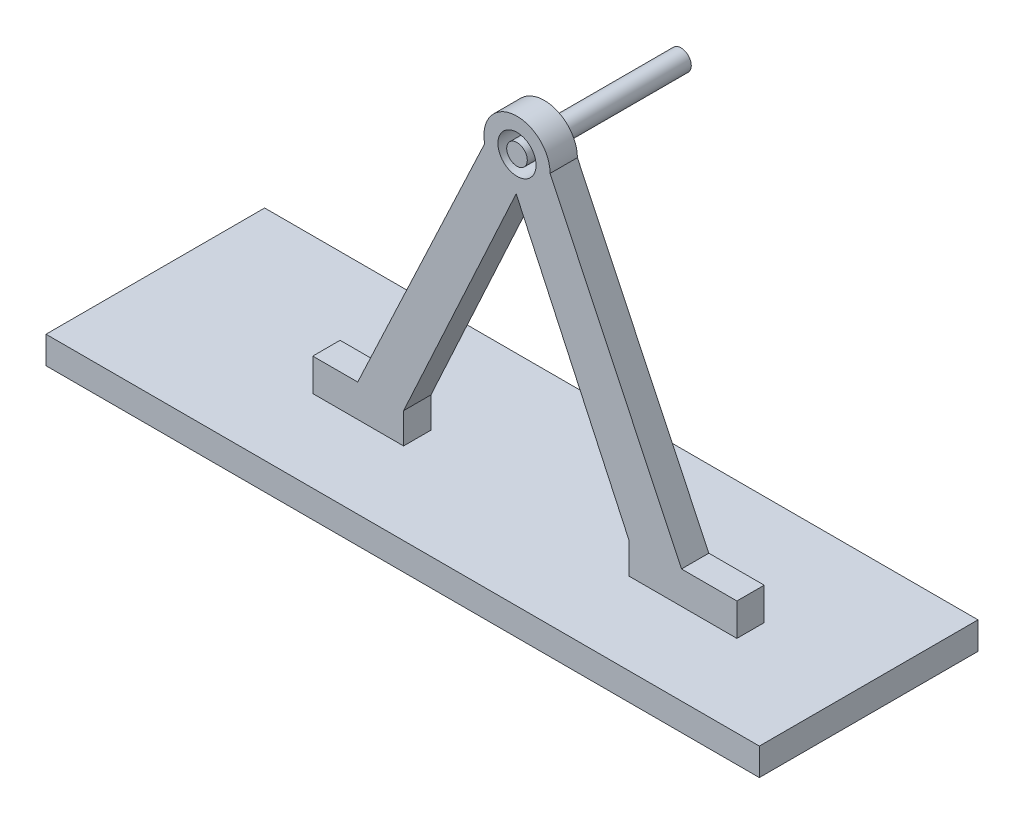
ISO-10303-21;
HEADER;
FILE_DESCRIPTION(('STEP AP214'),'2;1');
FILE_NAME('part.step','',(''),(''),'','','');
FILE_SCHEMA(('AUTOMOTIVE_DESIGN { 1 0 10303 214 1 1 1 1 }'));
ENDSEC;
DATA;
#1=APPLICATION_CONTEXT('core data for automotive mechanical design processes');
#2=APPLICATION_PROTOCOL_DEFINITION('international standard','automotive_design',2000,#1);
#3=PRODUCT_CONTEXT('',#1,'mechanical');
#4=PRODUCT('Part','Part','',(#3));
#5=PRODUCT_RELATED_PRODUCT_CATEGORY('part','',(#4));
#6=PRODUCT_DEFINITION_FORMATION('','',#4);
#7=PRODUCT_DEFINITION_CONTEXT('part definition',#1,'design');
#8=PRODUCT_DEFINITION('design','',#6,#7);
#9=PRODUCT_DEFINITION_SHAPE('','',#8);
#10=(LENGTH_UNIT() NAMED_UNIT(*) SI_UNIT(.MILLI.,.METRE.));
#11=(NAMED_UNIT(*) PLANE_ANGLE_UNIT() SI_UNIT($,.RADIAN.));
#12=(NAMED_UNIT(*) SI_UNIT($,.STERADIAN.) SOLID_ANGLE_UNIT());
#13=UNCERTAINTY_MEASURE_WITH_UNIT(LENGTH_MEASURE(1.E-05),#10,'distance_accuracy_value','');
#14=(GEOMETRIC_REPRESENTATION_CONTEXT(3) GLOBAL_UNCERTAINTY_ASSIGNED_CONTEXT((#13)) GLOBAL_UNIT_ASSIGNED_CONTEXT((#10,
#11,#12)) REPRESENTATION_CONTEXT('',''));
#15=CARTESIAN_POINT('',(0.,0.,0.));
#16=DIRECTION('',(0.,0.,1.));
#17=DIRECTION('',(1.,0.,0.));
#18=AXIS2_PLACEMENT_3D('',#15,#16,#17);
#19=CARTESIAN_POINT('',(72.3019356945702,62.562955716952,-45.72));
#20=DIRECTION('',(0.,0.,1.));
#21=DIRECTION('',(1.,0.,0.));
#22=AXIS2_PLACEMENT_3D('',#19,#20,#21);
#23=CYLINDRICAL_SURFACE('',#22,1.91572157546535);
#24=CARTESIAN_POINT('',(72.3019356945702,62.562955716952,-45.72));
#25=DIRECTION('',(0.,0.,1.));
#26=DIRECTION('',(1.,0.,0.));
#27=AXIS2_PLACEMENT_3D('',#24,#25,#26);
#28=CIRCLE('',#27,1.91572157546535);
#29=CARTESIAN_POINT('',(74.2176572700356,62.562955716952,-45.72));
#30=VERTEX_POINT('',#29);
#31=EDGE_CURVE('E11',#30,#30,#28,.T.);
#32=CARTESIAN_POINT('',(72.3019356945702,62.562955716952,-15.24));
#33=DIRECTION('',(0.,0.,1.));
#34=DIRECTION('',(1.,0.,0.));
#35=AXIS2_PLACEMENT_3D('',#32,#33,#34);
#36=CIRCLE('',#35,1.91572157546535);
#37=CARTESIAN_POINT('',(74.2176572700356,62.562955716952,-15.24));
#38=VERTEX_POINT('',#37);
#39=EDGE_CURVE('E50',#38,#38,#36,.T.);
#40=CARTESIAN_POINT('',(74.2176572700356,62.562955716952,-45.72));
#41=CARTESIAN_POINT('',(74.2176572700356,62.562955716952,-45.4025));
#42=CARTESIAN_POINT('',(74.2176572700356,62.562955716952,-45.085));
#43=CARTESIAN_POINT('',(74.2176572700356,62.562955716952,-44.45));
#44=CARTESIAN_POINT('',(74.2176572700356,62.562955716952,-44.1325));
#45=CARTESIAN_POINT('',(74.2176572700356,62.562955716952,-43.4975));
#46=CARTESIAN_POINT('',(74.2176572700356,62.562955716952,-43.18));
#47=CARTESIAN_POINT('',(74.2176572700356,62.562955716952,-42.545));
#48=CARTESIAN_POINT('',(74.2176572700356,62.562955716952,-42.2275));
#49=CARTESIAN_POINT('',(74.2176572700356,62.562955716952,-41.5925));
#50=CARTESIAN_POINT('',(74.2176572700356,62.562955716952,-41.275));
#51=CARTESIAN_POINT('',(74.2176572700356,62.562955716952,-40.64));
#52=CARTESIAN_POINT('',(74.2176572700356,62.562955716952,-40.3225));
#53=CARTESIAN_POINT('',(74.2176572700356,62.562955716952,-39.6875));
#54=CARTESIAN_POINT('',(74.2176572700356,62.562955716952,-39.37));
#55=CARTESIAN_POINT('',(74.2176572700356,62.562955716952,-38.735));
#56=CARTESIAN_POINT('',(74.2176572700356,62.562955716952,-38.4175));
#57=CARTESIAN_POINT('',(74.2176572700356,62.562955716952,-37.7825));
#58=CARTESIAN_POINT('',(74.2176572700356,62.562955716952,-37.465));
#59=CARTESIAN_POINT('',(74.2176572700356,62.562955716952,-36.83));
#60=CARTESIAN_POINT('',(74.2176572700356,62.562955716952,-36.5125));
#61=CARTESIAN_POINT('',(74.2176572700356,62.562955716952,-35.8775));
#62=CARTESIAN_POINT('',(74.2176572700356,62.562955716952,-35.56));
#63=CARTESIAN_POINT('',(74.2176572700356,62.562955716952,-34.925));
#64=CARTESIAN_POINT('',(74.2176572700356,62.562955716952,-34.6075));
#65=CARTESIAN_POINT('',(74.2176572700356,62.562955716952,-33.9725));
#66=CARTESIAN_POINT('',(74.2176572700356,62.562955716952,-33.655));
#67=CARTESIAN_POINT('',(74.2176572700356,62.562955716952,-33.02));
#68=CARTESIAN_POINT('',(74.2176572700356,62.562955716952,-32.7025));
#69=CARTESIAN_POINT('',(74.2176572700356,62.562955716952,-32.0675));
#70=CARTESIAN_POINT('',(74.2176572700356,62.562955716952,-31.75));
#71=CARTESIAN_POINT('',(74.2176572700356,62.562955716952,-31.115));
#72=CARTESIAN_POINT('',(74.2176572700356,62.562955716952,-30.7975));
#73=CARTESIAN_POINT('',(74.2176572700356,62.562955716952,-30.1625));
#74=CARTESIAN_POINT('',(74.2176572700356,62.562955716952,-29.845));
#75=CARTESIAN_POINT('',(74.2176572700356,62.562955716952,-29.21));
#76=CARTESIAN_POINT('',(74.2176572700356,62.562955716952,-28.8925));
#77=CARTESIAN_POINT('',(74.2176572700356,62.562955716952,-28.2575));
#78=CARTESIAN_POINT('',(74.2176572700356,62.562955716952,-27.94));
#79=CARTESIAN_POINT('',(74.2176572700356,62.562955716952,-27.305));
#80=CARTESIAN_POINT('',(74.2176572700356,62.562955716952,-26.9875));
#81=CARTESIAN_POINT('',(74.2176572700356,62.562955716952,-26.3525));
#82=CARTESIAN_POINT('',(74.2176572700356,62.562955716952,-26.035));
#83=CARTESIAN_POINT('',(74.2176572700356,62.562955716952,-25.4));
#84=CARTESIAN_POINT('',(74.2176572700356,62.562955716952,-25.0825));
#85=CARTESIAN_POINT('',(74.2176572700356,62.562955716952,-24.4475));
#86=CARTESIAN_POINT('',(74.2176572700356,62.562955716952,-24.13));
#87=CARTESIAN_POINT('',(74.2176572700356,62.562955716952,-23.495));
#88=CARTESIAN_POINT('',(74.2176572700356,62.562955716952,-23.1775));
#89=CARTESIAN_POINT('',(74.2176572700356,62.562955716952,-22.5425));
#90=CARTESIAN_POINT('',(74.2176572700356,62.562955716952,-22.225));
#91=CARTESIAN_POINT('',(74.2176572700356,62.562955716952,-21.59));
#92=CARTESIAN_POINT('',(74.2176572700356,62.562955716952,-21.2725));
#93=CARTESIAN_POINT('',(74.2176572700356,62.562955716952,-20.6375));
#94=CARTESIAN_POINT('',(74.2176572700356,62.562955716952,-20.32));
#95=CARTESIAN_POINT('',(74.2176572700356,62.562955716952,-19.685));
#96=CARTESIAN_POINT('',(74.2176572700356,62.562955716952,-19.3675));
#97=CARTESIAN_POINT('',(74.2176572700356,62.562955716952,-18.7325));
#98=CARTESIAN_POINT('',(74.2176572700356,62.562955716952,-18.415));
#99=CARTESIAN_POINT('',(74.2176572700356,62.562955716952,-17.78));
#100=CARTESIAN_POINT('',(74.2176572700356,62.562955716952,-17.4625));
#101=CARTESIAN_POINT('',(74.2176572700356,62.562955716952,-16.8275));
#102=CARTESIAN_POINT('',(74.2176572700356,62.562955716952,-16.51));
#103=CARTESIAN_POINT('',(74.2176572700356,62.562955716952,-15.875));
#104=CARTESIAN_POINT('',(74.2176572700356,62.562955716952,-15.5575));
#105=CARTESIAN_POINT('',(74.2176572700356,62.562955716952,-15.24));
#106=B_SPLINE_CURVE_WITH_KNOTS('',3,(#40,#41,#42,#43,#44,#45,#46,#47,#48,#49,#50,#51,#52,#53,
#54,#55,#56,#57,#58,#59,#60,#61,#62,#63,#64,#65,#66,#67,#68,#69,#70,#71,#72,#73,#74,#75,#76,#77,
#78,#79,#80,#81,#82,#83,#84,#85,#86,#87,#88,#89,#90,#91,#92,#93,#94,#95,#96,#97,#98,#99,#100,
#101,#102,#103,#104,#105),.UNSPECIFIED.,.F.,.F.,(4,2,2,2,2,2,2,2,2,2,2,2,2,2,2,2,2,2,2,2,2,2,2,
2,2,2,2,2,2,2,2,2,4),(0.,0.952500000000002,1.905,2.85750000000001,3.81000000000001,4.7625,
5.71500000000001,6.66750000000001,7.62,8.5725,9.52500000000001,10.4775,11.43,12.3825,13.335,
14.2875,15.24,16.1925,17.145,18.0975,19.05,20.0025,20.955,21.9075,22.86,23.8125,24.765,25.7175,
26.67,27.6225,28.575,29.5275,30.48),.UNSPECIFIED.);
#107=EDGE_CURVE('BSEAM47',#30,#38,#106,.T.);
#108=ORIENTED_EDGE('',*,*,#31,.T.);
#109=ORIENTED_EDGE('',*,*,#39,.F.);
#110=ORIENTED_EDGE('',*,*,#107,.T.);
#111=ORIENTED_EDGE('',*,*,#107,.F.);
#112=EDGE_LOOP('',(#108,#110,#109,#111));
#113=FACE_BOUND('',#112,.T.);
#114=ADVANCED_FACE('F47',(#113),#23,.T.);
#115=CARTESIAN_POINT('',(72.3019356945702,62.562955716952,-45.72));
#116=DIRECTION('',(0.,0.,1.));
#117=DIRECTION('',(1.,0.,0.));
#118=AXIS2_PLACEMENT_3D('',#115,#116,#117);
#119=PLANE('',#118);
#120=ORIENTED_EDGE('',*,*,#31,.F.);
#121=EDGE_LOOP('',(#120));
#122=FACE_BOUND('',#121,.T.);
#123=ADVANCED_FACE('F62',(#122),#119,.F.);
#124=CARTESIAN_POINT('',(72.3019356945702,62.562955716952,-15.24));
#125=DIRECTION('',(0.,0.,1.));
#126=DIRECTION('',(1.,0.,0.));
#127=AXIS2_PLACEMENT_3D('',#124,#125,#126);
#128=PLANE('',#127);
#129=ORIENTED_EDGE('',*,*,#39,.T.);
#130=EDGE_LOOP('',(#129));
#131=FACE_BOUND('',#130,.T.);
#132=ADVANCED_FACE('F59',(#131),#128,.T.);
#133=CLOSED_SHELL('',(#114,#123,#132));
#134=MANIFOLD_SOLID_BREP('B2',#133);
#135=CARTESIAN_POINT('',(0.,5.08,0.));
#136=DIRECTION('',(0.,-1.,0.));
#137=DIRECTION('',(0.,0.,-1.));
#138=AXIS2_PLACEMENT_3D('',#135,#136,#137);
#139=PLANE('',#138);
#140=DIRECTION('',(1.,0.,0.));
#141=VECTOR('',#140,1.);
#142=CARTESIAN_POINT('',(113.174490491584,5.08,-15.24));
#143=LINE('',#142,#141);
#144=CARTESIAN_POINT('',(93.1655333505554,5.08,-15.24));
#145=VERTEX_POINT('',#144);
#146=CARTESIAN_POINT('',(113.174490491584,5.08,-15.24));
#147=VERTEX_POINT('',#146);
#148=EDGE_CURVE('E257',#145,#147,#143,.T.);
#149=ORIENTED_EDGE('',*,*,#148,.F.);
#150=DIRECTION('',(0.,0.,1.));
#151=VECTOR('',#150,1.);
#152=CARTESIAN_POINT('',(93.1655333505554,5.08,-20.32));
#153=LINE('',#152,#151);
#154=CARTESIAN_POINT('',(93.1655333505554,5.08,-20.32));
#155=VERTEX_POINT('',#154);
#156=EDGE_CURVE('E242',#155,#145,#153,.T.);
#157=ORIENTED_EDGE('',*,*,#156,.F.);
#158=DIRECTION('',(1.,0.,0.));
#159=VECTOR('',#158,1.);
#160=CARTESIAN_POINT('',(42.6952816088071,5.08,-20.32));
#161=LINE('',#160,#159);
#162=CARTESIAN_POINT('',(113.174490491584,5.08,-20.32));
#163=VERTEX_POINT('',#162);
#164=EDGE_CURVE('E287',#155,#163,#161,.T.);
#165=ORIENTED_EDGE('',*,*,#164,.T.);
#166=DIRECTION('',(0.,0.,-1.));
#167=VECTOR('',#166,1.);
#168=CARTESIAN_POINT('',(113.174490491584,5.08,-15.24));
#169=LINE('',#168,#167);
#170=EDGE_CURVE('E310',#147,#163,#169,.T.);
#171=ORIENTED_EDGE('',*,*,#170,.F.);
#172=EDGE_LOOP('',(#149,#157,#165,#171));
#173=FACE_BOUND('',#172,.T.);
#174=DIRECTION('',(0.,0.,1.));
#175=VECTOR('',#174,1.);
#176=CARTESIAN_POINT('',(0.,5.08,0.));
#177=LINE('',#176,#175);
#178=CARTESIAN_POINT('',(0.,5.08,-40.64));
#179=VERTEX_POINT('',#178);
#180=CARTESIAN_POINT('',(0.,5.08,0.));
#181=VERTEX_POINT('',#180);
#182=EDGE_CURVE('E314',#179,#181,#177,.T.);
#183=ORIENTED_EDGE('',*,*,#182,.T.);
#184=DIRECTION('',(1.,0.,0.));
#185=VECTOR('',#184,1.);
#186=CARTESIAN_POINT('',(0.,5.08,0.));
#187=LINE('',#186,#185);
#188=CARTESIAN_POINT('',(132.588,5.08,0.));
#189=VERTEX_POINT('',#188);
#190=EDGE_CURVE('E317',#181,#189,#187,.T.);
#191=ORIENTED_EDGE('',*,*,#190,.T.);
#192=DIRECTION('',(0.,0.,-1.));
#193=VECTOR('',#192,1.);
#194=CARTESIAN_POINT('',(132.588,5.08,0.));
#195=LINE('',#194,#193);
#196=CARTESIAN_POINT('',(132.588,5.08,-40.64));
#197=VERTEX_POINT('',#196);
#198=EDGE_CURVE('E320',#189,#197,#195,.T.);
#199=ORIENTED_EDGE('',*,*,#198,.T.);
#200=DIRECTION('',(-1.,0.,0.));
#201=VECTOR('',#200,1.);
#202=CARTESIAN_POINT('',(0.,5.08,-40.64));
#203=LINE('',#202,#201);
#204=EDGE_CURVE('E322',#197,#179,#203,.T.);
#205=ORIENTED_EDGE('',*,*,#204,.T.);
#206=EDGE_LOOP('',(#183,#191,#199,#205));
#207=FACE_BOUND('',#206,.T.);
#208=DIRECTION('',(0.,0.,1.));
#209=VECTOR('',#208,1.);
#210=CARTESIAN_POINT('',(51.221825845041,5.08,-20.32));
#211=LINE('',#210,#209);
#212=CARTESIAN_POINT('',(51.221825845041,5.08,-20.32));
#213=VERTEX_POINT('',#212);
#214=CARTESIAN_POINT('',(51.221825845041,5.08,-15.24));
#215=VERTEX_POINT('',#214);
#216=EDGE_CURVE('E244',#213,#215,#211,.T.);
#217=ORIENTED_EDGE('',*,*,#216,.T.);
#218=CARTESIAN_POINT('',(34.340990791487,5.08,-15.24));
#219=VERTEX_POINT('',#218);
#220=EDGE_CURVE('E253',#219,#215,#143,.T.);
#221=ORIENTED_EDGE('',*,*,#220,.F.);
#222=DIRECTION('',(0.,0.,-1.));
#223=VECTOR('',#222,1.);
#224=CARTESIAN_POINT('',(34.340990791487,5.08,-15.24));
#225=LINE('',#224,#223);
#226=CARTESIAN_POINT('',(34.340990791487,5.08,-20.32));
#227=VERTEX_POINT('',#226);
#228=EDGE_CURVE('E272',#219,#227,#225,.T.);
#229=ORIENTED_EDGE('',*,*,#228,.T.);
#230=EDGE_CURVE('E288',#227,#213,#161,.T.);
#231=ORIENTED_EDGE('',*,*,#230,.T.);
#232=EDGE_LOOP('',(#217,#221,#229,#231));
#233=FACE_BOUND('',#232,.T.);
#234=ADVANCED_FACE('F88',(#173,#207,#233),#139,.F.);
#235=CARTESIAN_POINT('',(0.,5.08,0.));
#236=DIRECTION('',(1.,0.,0.));
#237=DIRECTION('',(0.,0.,-1.));
#238=AXIS2_PLACEMENT_3D('',#235,#236,#237);
#239=PLANE('',#238);
#240=DIRECTION('',(0.,0.,1.));
#241=VECTOR('',#240,1.);
#242=CARTESIAN_POINT('',(0.,0.,0.));
#243=LINE('',#242,#241);
#244=CARTESIAN_POINT('',(0.,0.,-40.64));
#245=VERTEX_POINT('',#244);
#246=CARTESIAN_POINT('',(0.,0.,0.));
#247=VERTEX_POINT('',#246);
#248=EDGE_CURVE('E313',#245,#247,#243,.T.);
#249=ORIENTED_EDGE('',*,*,#248,.T.);
#250=DIRECTION('',(0.,-1.,0.));
#251=VECTOR('',#250,1.);
#252=CARTESIAN_POINT('',(0.,5.08,0.));
#253=LINE('',#252,#251);
#254=EDGE_CURVE('E45',#181,#247,#253,.T.);
#255=ORIENTED_EDGE('',*,*,#254,.F.);
#256=ORIENTED_EDGE('',*,*,#182,.F.);
#257=DIRECTION('',(0.,-1.,0.));
#258=VECTOR('',#257,1.);
#259=CARTESIAN_POINT('',(0.,5.08,-40.64));
#260=LINE('',#259,#258);
#261=EDGE_CURVE('E324',#179,#245,#260,.T.);
#262=ORIENTED_EDGE('',*,*,#261,.T.);
#263=EDGE_LOOP('',(#249,#255,#256,#262));
#264=FACE_BOUND('',#263,.T.);
#265=ADVANCED_FACE('F90',(#264),#239,.F.);
#266=CARTESIAN_POINT('',(0.,5.08,0.));
#267=DIRECTION('',(0.,0.,-1.));
#268=DIRECTION('',(-1.,0.,0.));
#269=AXIS2_PLACEMENT_3D('',#266,#267,#268);
#270=PLANE('',#269);
#271=DIRECTION('',(1.,0.,0.));
#272=VECTOR('',#271,1.);
#273=CARTESIAN_POINT('',(0.,0.,0.));
#274=LINE('',#273,#272);
#275=CARTESIAN_POINT('',(132.588,0.,0.));
#276=VERTEX_POINT('',#275);
#277=EDGE_CURVE('E327',#247,#276,#274,.T.);
#278=ORIENTED_EDGE('',*,*,#277,.T.);
#279=DIRECTION('',(0.,-1.,0.));
#280=VECTOR('',#279,1.);
#281=CARTESIAN_POINT('',(132.588,5.08,0.));
#282=LINE('',#281,#280);
#283=EDGE_CURVE('E96',#189,#276,#282,.T.);
#284=ORIENTED_EDGE('',*,*,#283,.F.);
#285=ORIENTED_EDGE('',*,*,#190,.F.);
#286=ORIENTED_EDGE('',*,*,#254,.T.);
#287=EDGE_LOOP('',(#278,#284,#285,#286));
#288=FACE_BOUND('',#287,.T.);
#289=ADVANCED_FACE('F357',(#288),#270,.F.);
#290=CARTESIAN_POINT('',(132.588,5.08,0.));
#291=DIRECTION('',(-1.,0.,0.));
#292=DIRECTION('',(0.,0.,1.));
#293=AXIS2_PLACEMENT_3D('',#290,#291,#292);
#294=PLANE('',#293);
#295=DIRECTION('',(0.,0.,-1.));
#296=VECTOR('',#295,1.);
#297=CARTESIAN_POINT('',(132.588,0.,0.));
#298=LINE('',#297,#296);
#299=CARTESIAN_POINT('',(132.588,0.,-40.64));
#300=VERTEX_POINT('',#299);
#301=EDGE_CURVE('E329',#276,#300,#298,.T.);
#302=ORIENTED_EDGE('',*,*,#301,.T.);
#303=DIRECTION('',(0.,-1.,0.));
#304=VECTOR('',#303,1.);
#305=CARTESIAN_POINT('',(132.588,5.08,-40.64));
#306=LINE('',#305,#304);
#307=EDGE_CURVE('E334',#197,#300,#306,.T.);
#308=ORIENTED_EDGE('',*,*,#307,.F.);
#309=ORIENTED_EDGE('',*,*,#198,.F.);
#310=ORIENTED_EDGE('',*,*,#283,.T.);
#311=EDGE_LOOP('',(#302,#308,#309,#310));
#312=FACE_BOUND('',#311,.T.);
#313=ADVANCED_FACE('F341',(#312),#294,.F.);
#314=CARTESIAN_POINT('',(0.,5.08,-40.64));
#315=DIRECTION('',(0.,0.,1.));
#316=DIRECTION('',(1.,0.,0.));
#317=AXIS2_PLACEMENT_3D('',#314,#315,#316);
#318=PLANE('',#317);
#319=DIRECTION('',(-1.,0.,0.));
#320=VECTOR('',#319,1.);
#321=CARTESIAN_POINT('',(0.,0.,-40.64));
#322=LINE('',#321,#320);
#323=EDGE_CURVE('E318',#300,#245,#322,.T.);
#324=ORIENTED_EDGE('',*,*,#323,.T.);
#325=ORIENTED_EDGE('',*,*,#261,.F.);
#326=ORIENTED_EDGE('',*,*,#204,.F.);
#327=ORIENTED_EDGE('',*,*,#307,.T.);
#328=EDGE_LOOP('',(#324,#325,#326,#327));
#329=FACE_BOUND('',#328,.T.);
#330=ADVANCED_FACE('F350',(#329),#318,.F.);
#331=CARTESIAN_POINT('',(0.,0.,0.));
#332=DIRECTION('',(0.,-1.,0.));
#333=DIRECTION('',(0.,0.,-1.));
#334=AXIS2_PLACEMENT_3D('',#331,#332,#333);
#335=PLANE('',#334);
#336=ORIENTED_EDGE('',*,*,#248,.F.);
#337=ORIENTED_EDGE('',*,*,#323,.F.);
#338=ORIENTED_EDGE('',*,*,#301,.F.);
#339=ORIENTED_EDGE('',*,*,#277,.F.);
#340=EDGE_LOOP('',(#336,#337,#338,#339));
#341=FACE_BOUND('',#340,.T.);
#342=ADVANCED_FACE('F347',(#341),#335,.T.);
#343=CARTESIAN_POINT('',(72.3019356945702,62.562955716952,-15.24));
#344=DIRECTION('',(0.,0.,1.));
#345=DIRECTION('',(1.,0.,0.));
#346=AXIS2_PLACEMENT_3D('',#343,#344,#345);
#347=PLANE('',#346);
#348=DIRECTION('',(0.,1.,0.));
#349=VECTOR('',#348,1.);
#350=CARTESIAN_POINT('',(93.1655333505554,5.08,-15.24));
#351=LINE('',#350,#349);
#352=CARTESIAN_POINT('',(93.1655333505554,10.7582590870713,-15.24));
#353=VERTEX_POINT('',#352);
#354=EDGE_CURVE('E226',#145,#353,#351,.T.);
#355=ORIENTED_EDGE('',*,*,#354,.F.);
#356=ORIENTED_EDGE('',*,*,#148,.T.);
#357=DIRECTION('',(0.,1.,0.));
#358=VECTOR('',#357,1.);
#359=CARTESIAN_POINT('',(113.174490491584,11.1096075909624,-15.24));
#360=LINE('',#359,#358);
#361=CARTESIAN_POINT('',(113.174490491584,11.1096075909624,-15.24));
#362=VERTEX_POINT('',#361);
#363=EDGE_CURVE('E256',#147,#362,#360,.T.);
#364=ORIENTED_EDGE('',*,*,#363,.T.);
#365=DIRECTION('',(-1.,0.,0.));
#366=VECTOR('',#365,1.);
#367=CARTESIAN_POINT('',(102.880626177295,11.1096075909624,-15.24));
#368=LINE('',#367,#366);
#369=CARTESIAN_POINT('',(102.880626177295,11.1096075909624,-15.24));
#370=VERTEX_POINT('',#369);
#371=EDGE_CURVE('E259',#362,#370,#368,.T.);
#372=ORIENTED_EDGE('',*,*,#371,.T.);
#373=DIRECTION('',(-0.428938362432932,0.903333759600157,0.));
#374=VECTOR('',#373,1.);
#375=CARTESIAN_POINT('',(78.4485548057757,62.562955716952,-15.24));
#376=LINE('',#375,#374);
#377=CARTESIAN_POINT('',(78.4485548057757,62.562955716952,-15.24));
#378=VERTEX_POINT('',#377);
#379=EDGE_CURVE('E261',#370,#378,#376,.T.);
#380=ORIENTED_EDGE('',*,*,#379,.T.);
#381=CARTESIAN_POINT('',(72.3019356945702,62.562955716952,-15.24));
#382=DIRECTION('',(0.,0.,1.));
#383=DIRECTION('',(1.,0.,0.));
#384=AXIS2_PLACEMENT_3D('',#381,#382,#383);
#385=CIRCLE('',#384,6.14661911120553);
#386=CARTESIAN_POINT('',(66.294,61.2646355760984,-15.24));
#387=VERTEX_POINT('',#386);
#388=EDGE_CURVE('E263',#378,#387,#385,.T.);
#389=ORIENTED_EDGE('',*,*,#388,.T.);
#390=DIRECTION('',(-0.425743158522656,-0.904844054503953,0.));
#391=VECTOR('',#390,1.);
#392=CARTESIAN_POINT('',(42.6952816088071,11.1096075909624,-15.24));
#393=LINE('',#392,#391);
#394=CARTESIAN_POINT('',(42.6952816088071,11.1096075909624,-15.24));
#395=VERTEX_POINT('',#394);
#396=EDGE_CURVE('E265',#387,#395,#393,.T.);
#397=ORIENTED_EDGE('',*,*,#396,.T.);
#398=DIRECTION('',(-1.,0.,0.));
#399=VECTOR('',#398,1.);
#400=CARTESIAN_POINT('',(34.340990791487,11.1096075909624,-15.24));
#401=LINE('',#400,#399);
#402=CARTESIAN_POINT('',(34.340990791487,11.1096075909624,-15.24));
#403=VERTEX_POINT('',#402);
#404=EDGE_CURVE('E267',#395,#403,#401,.T.);
#405=ORIENTED_EDGE('',*,*,#404,.T.);
#406=DIRECTION('',(0.,-1.,0.));
#407=VECTOR('',#406,1.);
#408=CARTESIAN_POINT('',(34.340990791487,5.08,-15.24));
#409=LINE('',#408,#407);
#410=EDGE_CURVE('E269',#403,#219,#409,.T.);
#411=ORIENTED_EDGE('',*,*,#410,.T.);
#412=ORIENTED_EDGE('',*,*,#220,.T.);
#413=DIRECTION('',(0.,-1.,0.));
#414=VECTOR('',#413,1.);
#415=CARTESIAN_POINT('',(51.221825845041,10.7582590870713,-15.24));
#416=LINE('',#415,#414);
#417=CARTESIAN_POINT('',(51.221825845041,10.7582590870713,-15.24));
#418=VERTEX_POINT('',#417);
#419=EDGE_CURVE('E229',#418,#215,#416,.T.);
#420=ORIENTED_EDGE('',*,*,#419,.F.);
#421=DIRECTION('',(-0.418730327548393,-0.908110628057626,0.));
#422=VECTOR('',#421,1.);
#423=CARTESIAN_POINT('',(72.1506162430698,56.147034970862,-15.24));
#424=LINE('',#423,#422);
#425=CARTESIAN_POINT('',(72.1506162430698,56.147034970862,-15.24));
#426=VERTEX_POINT('',#425);
#427=EDGE_CURVE('E235',#426,#418,#424,.T.);
#428=ORIENTED_EDGE('',*,*,#427,.F.);
#429=DIRECTION('',(-0.420149827177772,0.907454749683139,0.));
#430=VECTOR('',#429,1.);
#431=CARTESIAN_POINT('',(93.1655333505554,10.7582590870713,-15.24));
#432=LINE('',#431,#430);
#433=EDGE_CURVE('E103',#353,#426,#432,.T.);
#434=ORIENTED_EDGE('',*,*,#433,.F.);
#435=EDGE_LOOP('',(#355,#356,#364,#372,#380,#389,#397,#405,#411,#412,#420,#428,#434));
#436=FACE_BOUND('',#435,.T.);
#437=CARTESIAN_POINT('',(72.3019356945702,62.562955716952,-15.24));
#438=DIRECTION('',(0.,0.,1.));
#439=DIRECTION('',(1.,0.,0.));
#440=AXIS2_PLACEMENT_3D('',#437,#438,#439);
#441=CIRCLE('',#440,3.54179385001175);
#442=CARTESIAN_POINT('',(75.843729544582,62.562955716952,-15.24));
#443=VERTEX_POINT('',#442);
#444=EDGE_CURVE('E247',#443,#443,#441,.T.);
#445=ORIENTED_EDGE('',*,*,#444,.F.);
#446=EDGE_LOOP('',(#445));
#447=FACE_BOUND('',#446,.T.);
#448=ADVANCED_FACE('F378',(#436,#447),#347,.T.);
#449=CARTESIAN_POINT('',(72.3019356945702,62.562955716952,-20.32));
#450=DIRECTION('',(0.,0.,1.));
#451=DIRECTION('',(1.,0.,0.));
#452=AXIS2_PLACEMENT_3D('',#449,#450,#451);
#453=PLANE('',#452);
#454=ORIENTED_EDGE('',*,*,#164,.F.);
#455=DIRECTION('',(0.,1.,0.));
#456=VECTOR('',#455,1.);
#457=CARTESIAN_POINT('',(93.1655333505554,5.08,-20.32));
#458=LINE('',#457,#456);
#459=CARTESIAN_POINT('',(93.1655333505554,10.7582590870713,-20.32));
#460=VERTEX_POINT('',#459);
#461=EDGE_CURVE('E215',#155,#460,#458,.T.);
#462=ORIENTED_EDGE('',*,*,#461,.T.);
#463=DIRECTION('',(-0.420149827177772,0.907454749683139,0.));
#464=VECTOR('',#463,1.);
#465=CARTESIAN_POINT('',(93.1655333505554,10.7582590870713,-20.32));
#466=LINE('',#465,#464);
#467=CARTESIAN_POINT('',(72.1506162430698,56.147034970862,-20.32));
#468=VERTEX_POINT('',#467);
#469=EDGE_CURVE('E209',#460,#468,#466,.T.);
#470=ORIENTED_EDGE('',*,*,#469,.T.);
#471=DIRECTION('',(-0.418730327548393,-0.908110628057626,0.));
#472=VECTOR('',#471,1.);
#473=CARTESIAN_POINT('',(72.1506162430698,56.147034970862,-20.32));
#474=LINE('',#473,#472);
#475=CARTESIAN_POINT('',(51.221825845041,10.7582590870713,-20.32));
#476=VERTEX_POINT('',#475);
#477=EDGE_CURVE('E218',#468,#476,#474,.T.);
#478=ORIENTED_EDGE('',*,*,#477,.T.);
#479=DIRECTION('',(0.,-1.,0.));
#480=VECTOR('',#479,1.);
#481=CARTESIAN_POINT('',(51.221825845041,10.7582590870713,-20.32));
#482=LINE('',#481,#480);
#483=EDGE_CURVE('E111',#476,#213,#482,.T.);
#484=ORIENTED_EDGE('',*,*,#483,.T.);
#485=ORIENTED_EDGE('',*,*,#230,.F.);
#486=DIRECTION('',(0.,-1.,0.));
#487=VECTOR('',#486,1.);
#488=CARTESIAN_POINT('',(34.340990791487,5.08,-20.32));
#489=LINE('',#488,#487);
#490=CARTESIAN_POINT('',(34.340990791487,11.1096075909624,-20.32));
#491=VERTEX_POINT('',#490);
#492=EDGE_CURVE('E284',#491,#227,#489,.T.);
#493=ORIENTED_EDGE('',*,*,#492,.F.);
#494=DIRECTION('',(-1.,0.,0.));
#495=VECTOR('',#494,1.);
#496=CARTESIAN_POINT('',(34.340990791487,11.1096075909624,-20.32));
#497=LINE('',#496,#495);
#498=CARTESIAN_POINT('',(42.6952816088071,11.1096075909624,-20.32));
#499=VERTEX_POINT('',#498);
#500=EDGE_CURVE('E282',#499,#491,#497,.T.);
#501=ORIENTED_EDGE('',*,*,#500,.F.);
#502=DIRECTION('',(-0.425743158522656,-0.904844054503953,0.));
#503=VECTOR('',#502,1.);
#504=CARTESIAN_POINT('',(42.6952816088071,11.1096075909624,-20.32));
#505=LINE('',#504,#503);
#506=CARTESIAN_POINT('',(66.294,61.2646355760984,-20.32));
#507=VERTEX_POINT('',#506);
#508=EDGE_CURVE('E280',#507,#499,#505,.T.);
#509=ORIENTED_EDGE('',*,*,#508,.F.);
#510=CARTESIAN_POINT('',(72.3019356945702,62.562955716952,-20.32));
#511=DIRECTION('',(0.,0.,1.));
#512=DIRECTION('',(1.,0.,0.));
#513=AXIS2_PLACEMENT_3D('',#510,#511,#512);
#514=CIRCLE('',#513,6.14661911120553);
#515=CARTESIAN_POINT('',(78.4485548057757,62.562955716952,-20.32));
#516=VERTEX_POINT('',#515);
#517=EDGE_CURVE('E278',#516,#507,#514,.T.);
#518=ORIENTED_EDGE('',*,*,#517,.F.);
#519=DIRECTION('',(-0.428938362432932,0.903333759600157,0.));
#520=VECTOR('',#519,1.);
#521=CARTESIAN_POINT('',(78.4485548057757,62.562955716952,-20.32));
#522=LINE('',#521,#520);
#523=CARTESIAN_POINT('',(102.880626177295,11.1096075909624,-20.32));
#524=VERTEX_POINT('',#523);
#525=EDGE_CURVE('E276',#524,#516,#522,.T.);
#526=ORIENTED_EDGE('',*,*,#525,.F.);
#527=DIRECTION('',(-1.,0.,0.));
#528=VECTOR('',#527,1.);
#529=CARTESIAN_POINT('',(102.880626177295,11.1096075909624,-20.32));
#530=LINE('',#529,#528);
#531=CARTESIAN_POINT('',(113.174490491584,11.1096075909624,-20.32));
#532=VERTEX_POINT('',#531);
#533=EDGE_CURVE('E274',#532,#524,#530,.T.);
#534=ORIENTED_EDGE('',*,*,#533,.F.);
#535=DIRECTION('',(0.,1.,0.));
#536=VECTOR('',#535,1.);
#537=CARTESIAN_POINT('',(113.174490491584,11.1096075909624,-20.32));
#538=LINE('',#537,#536);
#539=EDGE_CURVE('E250',#163,#532,#538,.T.);
#540=ORIENTED_EDGE('',*,*,#539,.F.);
#541=EDGE_LOOP('',(#454,#462,#470,#478,#484,#485,#493,#501,#509,#518,#526,#534,#540));
#542=FACE_BOUND('',#541,.T.);
#543=CARTESIAN_POINT('',(72.3019356945702,62.562955716952,-20.32));
#544=DIRECTION('',(0.,0.,1.));
#545=DIRECTION('',(1.,0.,0.));
#546=AXIS2_PLACEMENT_3D('',#543,#544,#545);
#547=CIRCLE('',#546,3.54179385001175);
#548=CARTESIAN_POINT('',(75.843729544582,62.562955716952,-20.32));
#549=VERTEX_POINT('',#548);
#550=EDGE_CURVE('E241',#549,#549,#547,.T.);
#551=ORIENTED_EDGE('',*,*,#550,.T.);
#552=EDGE_LOOP('',(#551));
#553=FACE_BOUND('',#552,.T.);
#554=ADVANCED_FACE('F223',(#542,#553),#453,.F.);
#555=CARTESIAN_POINT('',(113.174490491584,11.1096075909624,-15.24));
#556=DIRECTION('',(-1.,0.,0.));
#557=DIRECTION('',(0.,0.,1.));
#558=AXIS2_PLACEMENT_3D('',#555,#556,#557);
#559=PLANE('',#558);
#560=ORIENTED_EDGE('',*,*,#539,.T.);
#561=DIRECTION('',(0.,0.,-1.));
#562=VECTOR('',#561,1.);
#563=CARTESIAN_POINT('',(113.174490491584,11.1096075909624,-15.24));
#564=LINE('',#563,#562);
#565=EDGE_CURVE('E307',#362,#532,#564,.T.);
#566=ORIENTED_EDGE('',*,*,#565,.F.);
#567=ORIENTED_EDGE('',*,*,#363,.F.);
#568=ORIENTED_EDGE('',*,*,#170,.T.);
#569=EDGE_LOOP('',(#560,#566,#567,#568));
#570=FACE_BOUND('',#569,.T.);
#571=ADVANCED_FACE('F374',(#570),#559,.F.);
#572=CARTESIAN_POINT('',(102.880626177295,11.1096075909624,-15.24));
#573=DIRECTION('',(0.,-1.,0.));
#574=DIRECTION('',(0.,0.,-1.));
#575=AXIS2_PLACEMENT_3D('',#572,#573,#574);
#576=PLANE('',#575);
#577=ORIENTED_EDGE('',*,*,#533,.T.);
#578=DIRECTION('',(0.,0.,-1.));
#579=VECTOR('',#578,1.);
#580=CARTESIAN_POINT('',(102.880626177295,11.1096075909624,-15.24));
#581=LINE('',#580,#579);
#582=EDGE_CURVE('E304',#370,#524,#581,.T.);
#583=ORIENTED_EDGE('',*,*,#582,.F.);
#584=ORIENTED_EDGE('',*,*,#371,.F.);
#585=ORIENTED_EDGE('',*,*,#565,.T.);
#586=EDGE_LOOP('',(#577,#583,#584,#585));
#587=FACE_BOUND('',#586,.T.);
#588=ADVANCED_FACE('F397',(#587),#576,.F.);
#589=CARTESIAN_POINT('',(78.4485548057757,62.562955716952,-15.24));
#590=DIRECTION('',(-0.903333759600157,-0.428938362432932,0.));
#591=DIRECTION('',(0.428938362432932,-0.903333759600157,0.));
#592=AXIS2_PLACEMENT_3D('',#589,#590,#591);
#593=PLANE('',#592);
#594=ORIENTED_EDGE('',*,*,#525,.T.);
#595=DIRECTION('',(0.,0.,-1.));
#596=VECTOR('',#595,1.);
#597=CARTESIAN_POINT('',(78.4485548057757,62.562955716952,-15.24));
#598=LINE('',#597,#596);
#599=EDGE_CURVE('E301',#378,#516,#598,.T.);
#600=ORIENTED_EDGE('',*,*,#599,.F.);
#601=ORIENTED_EDGE('',*,*,#379,.F.);
#602=ORIENTED_EDGE('',*,*,#582,.T.);
#603=EDGE_LOOP('',(#594,#600,#601,#602));
#604=FACE_BOUND('',#603,.T.);
#605=ADVANCED_FACE('F406',(#604),#593,.F.);
#606=CARTESIAN_POINT('',(72.3019356945702,62.562955716952,-15.24));
#607=DIRECTION('',(0.,0.,-1.));
#608=DIRECTION('',(-1.,0.,0.));
#609=AXIS2_PLACEMENT_3D('',#606,#607,#608);
#610=CYLINDRICAL_SURFACE('',#609,6.14661911120553);
#611=ORIENTED_EDGE('',*,*,#517,.T.);
#612=DIRECTION('',(0.,0.,-1.));
#613=VECTOR('',#612,1.);
#614=CARTESIAN_POINT('',(66.294,61.2646355760984,-15.24));
#615=LINE('',#614,#613);
#616=EDGE_CURVE('E298',#387,#507,#615,.T.);
#617=ORIENTED_EDGE('',*,*,#616,.F.);
#618=ORIENTED_EDGE('',*,*,#388,.F.);
#619=ORIENTED_EDGE('',*,*,#599,.T.);
#620=EDGE_LOOP('',(#611,#617,#618,#619));
#621=FACE_BOUND('',#620,.T.);
#622=ADVANCED_FACE('F414',(#621),#610,.T.);
#623=CARTESIAN_POINT('',(42.6952816088071,11.1096075909624,-15.24));
#624=DIRECTION('',(0.904844054503953,-0.425743158522656,0.));
#625=DIRECTION('',(0.425743158522656,0.904844054503953,0.));
#626=AXIS2_PLACEMENT_3D('',#623,#624,#625);
#627=PLANE('',#626);
#628=ORIENTED_EDGE('',*,*,#508,.T.);
#629=DIRECTION('',(0.,0.,-1.));
#630=VECTOR('',#629,1.);
#631=CARTESIAN_POINT('',(42.6952816088071,11.1096075909624,-15.24));
#632=LINE('',#631,#630);
#633=EDGE_CURVE('E295',#395,#499,#632,.T.);
#634=ORIENTED_EDGE('',*,*,#633,.F.);
#635=ORIENTED_EDGE('',*,*,#396,.F.);
#636=ORIENTED_EDGE('',*,*,#616,.T.);
#637=EDGE_LOOP('',(#628,#634,#635,#636));
#638=FACE_BOUND('',#637,.T.);
#639=ADVANCED_FACE('F423',(#638),#627,.F.);
#640=CARTESIAN_POINT('',(34.340990791487,11.1096075909624,-15.24));
#641=DIRECTION('',(0.,-1.,0.));
#642=DIRECTION('',(0.,0.,-1.));
#643=AXIS2_PLACEMENT_3D('',#640,#641,#642);
#644=PLANE('',#643);
#645=ORIENTED_EDGE('',*,*,#500,.T.);
#646=DIRECTION('',(0.,0.,-1.));
#647=VECTOR('',#646,1.);
#648=CARTESIAN_POINT('',(34.340990791487,11.1096075909624,-15.24));
#649=LINE('',#648,#647);
#650=EDGE_CURVE('E292',#403,#491,#649,.T.);
#651=ORIENTED_EDGE('',*,*,#650,.F.);
#652=ORIENTED_EDGE('',*,*,#404,.F.);
#653=ORIENTED_EDGE('',*,*,#633,.T.);
#654=EDGE_LOOP('',(#645,#651,#652,#653));
#655=FACE_BOUND('',#654,.T.);
#656=ADVANCED_FACE('F432',(#655),#644,.F.);
#657=CARTESIAN_POINT('',(34.340990791487,5.08,-15.24));
#658=DIRECTION('',(1.,0.,0.));
#659=DIRECTION('',(0.,0.,-1.));
#660=AXIS2_PLACEMENT_3D('',#657,#658,#659);
#661=PLANE('',#660);
#662=ORIENTED_EDGE('',*,*,#492,.T.);
#663=ORIENTED_EDGE('',*,*,#228,.F.);
#664=ORIENTED_EDGE('',*,*,#410,.F.);
#665=ORIENTED_EDGE('',*,*,#650,.T.);
#666=EDGE_LOOP('',(#662,#663,#664,#665));
#667=FACE_BOUND('',#666,.T.);
#668=ADVANCED_FACE('F441',(#667),#661,.F.);
#669=CARTESIAN_POINT('',(72.3019356945702,62.562955716952,-15.24));
#670=DIRECTION('',(0.,0.,-1.));
#671=DIRECTION('',(-1.,0.,0.));
#672=AXIS2_PLACEMENT_3D('',#669,#670,#671);
#673=CYLINDRICAL_SURFACE('',#672,3.54179385001175);
#674=ORIENTED_EDGE('',*,*,#444,.T.);
#675=EDGE_LOOP('',(#674));
#676=FACE_BOUND('',#675,.T.);
#677=ORIENTED_EDGE('',*,*,#550,.F.);
#678=EDGE_LOOP('',(#677));
#679=FACE_BOUND('',#678,.T.);
#680=ADVANCED_FACE('F449',(#676,#679),#673,.F.);
#681=CARTESIAN_POINT('',(93.1655333505554,10.7582590870713,-20.32));
#682=DIRECTION('',(0.907454749683139,0.420149827177772,0.));
#683=DIRECTION('',(-0.420149827177772,0.907454749683139,0.));
#684=AXIS2_PLACEMENT_3D('',#681,#682,#683);
#685=PLANE('',#684);
#686=ORIENTED_EDGE('',*,*,#433,.T.);
#687=DIRECTION('',(0.,0.,1.));
#688=VECTOR('',#687,1.);
#689=CARTESIAN_POINT('',(72.1506162430698,56.147034970862,-20.32));
#690=LINE('',#689,#688);
#691=EDGE_CURVE('E205',#468,#426,#690,.T.);
#692=ORIENTED_EDGE('',*,*,#691,.F.);
#693=ORIENTED_EDGE('',*,*,#469,.F.);
#694=DIRECTION('',(0.,0.,1.));
#695=VECTOR('',#694,1.);
#696=CARTESIAN_POINT('',(93.1655333505554,10.7582590870713,-20.32));
#697=LINE('',#696,#695);
#698=EDGE_CURVE('E239',#460,#353,#697,.T.);
#699=ORIENTED_EDGE('',*,*,#698,.T.);
#700=EDGE_LOOP('',(#686,#692,#693,#699));
#701=FACE_BOUND('',#700,.T.);
#702=ADVANCED_FACE('F207',(#701),#685,.F.);
#703=CARTESIAN_POINT('',(93.1655333505554,5.08,-20.32));
#704=DIRECTION('',(1.,0.,0.));
#705=DIRECTION('',(0.,0.,-1.));
#706=AXIS2_PLACEMENT_3D('',#703,#704,#705);
#707=PLANE('',#706);
#708=ORIENTED_EDGE('',*,*,#354,.T.);
#709=ORIENTED_EDGE('',*,*,#698,.F.);
#710=ORIENTED_EDGE('',*,*,#461,.F.);
#711=ORIENTED_EDGE('',*,*,#156,.T.);
#712=EDGE_LOOP('',(#708,#709,#710,#711));
#713=FACE_BOUND('',#712,.T.);
#714=ADVANCED_FACE('F474',(#713),#707,.F.);
#715=CARTESIAN_POINT('',(51.221825845041,10.7582590870713,-20.32));
#716=DIRECTION('',(-1.,0.,0.));
#717=DIRECTION('',(0.,0.,1.));
#718=AXIS2_PLACEMENT_3D('',#715,#716,#717);
#719=PLANE('',#718);
#720=ORIENTED_EDGE('',*,*,#419,.T.);
#721=ORIENTED_EDGE('',*,*,#216,.F.);
#722=ORIENTED_EDGE('',*,*,#483,.F.);
#723=DIRECTION('',(0.,0.,1.));
#724=VECTOR('',#723,1.);
#725=CARTESIAN_POINT('',(51.221825845041,10.7582590870713,-20.32));
#726=LINE('',#725,#724);
#727=EDGE_CURVE('E214',#476,#418,#726,.T.);
#728=ORIENTED_EDGE('',*,*,#727,.T.);
#729=EDGE_LOOP('',(#720,#721,#722,#728));
#730=FACE_BOUND('',#729,.T.);
#731=ADVANCED_FACE('F484',(#730),#719,.F.);
#732=CARTESIAN_POINT('',(72.1506162430698,56.147034970862,-20.32));
#733=DIRECTION('',(-0.908110628057626,0.418730327548393,0.));
#734=DIRECTION('',(-0.418730327548393,-0.908110628057626,0.));
#735=AXIS2_PLACEMENT_3D('',#732,#733,#734);
#736=PLANE('',#735);
#737=ORIENTED_EDGE('',*,*,#427,.T.);
#738=ORIENTED_EDGE('',*,*,#727,.F.);
#739=ORIENTED_EDGE('',*,*,#477,.F.);
#740=ORIENTED_EDGE('',*,*,#691,.T.);
#741=EDGE_LOOP('',(#737,#738,#739,#740));
#742=FACE_BOUND('',#741,.T.);
#743=ADVANCED_FACE('F219',(#742),#736,.F.);
#744=CLOSED_SHELL('',(#234,#265,#289,#313,#330,#342,#448,#554,#571,#588,#605,#622,#639,#656,
#668,#680,#702,#714,#731,#743));
#745=MANIFOLD_SOLID_BREP('B6',#744);
#746=ADVANCED_BREP_SHAPE_REPRESENTATION('',(#18,#134,#745),#14);
#747=SHAPE_DEFINITION_REPRESENTATION(#9,#746);
ENDSEC;
END-ISO-10303-21;
